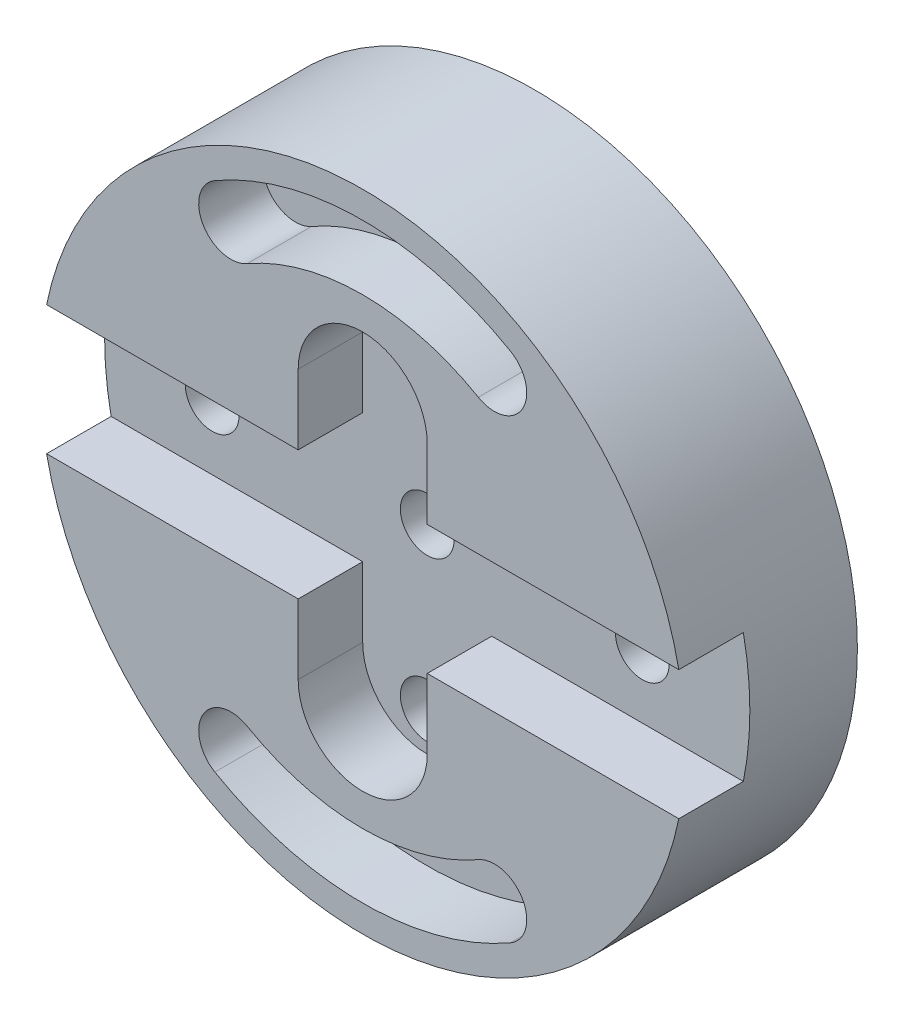
ISO-10303-21;
HEADER;
FILE_DESCRIPTION(('STEP AP214'),'2;1');
FILE_NAME('part.step','',(''),(''),'','','');
FILE_SCHEMA(('AUTOMOTIVE_DESIGN { 1 0 10303 214 1 1 1 1 }'));
ENDSEC;
DATA;
#1=APPLICATION_CONTEXT('core data for automotive mechanical design processes');
#2=APPLICATION_PROTOCOL_DEFINITION('international standard','automotive_design',2000,#1);
#3=PRODUCT_CONTEXT('',#1,'mechanical');
#4=PRODUCT('Part','Part','',(#3));
#5=PRODUCT_RELATED_PRODUCT_CATEGORY('part','',(#4));
#6=PRODUCT_DEFINITION_FORMATION('','',#4);
#7=PRODUCT_DEFINITION_CONTEXT('part definition',#1,'design');
#8=PRODUCT_DEFINITION('design','',#6,#7);
#9=PRODUCT_DEFINITION_SHAPE('','',#8);
#10=(LENGTH_UNIT() NAMED_UNIT(*) SI_UNIT(.MILLI.,.METRE.));
#11=(NAMED_UNIT(*) PLANE_ANGLE_UNIT() SI_UNIT($,.RADIAN.));
#12=(NAMED_UNIT(*) SI_UNIT($,.STERADIAN.) SOLID_ANGLE_UNIT());
#13=UNCERTAINTY_MEASURE_WITH_UNIT(LENGTH_MEASURE(1.E-05),#10,'distance_accuracy_value','');
#14=(GEOMETRIC_REPRESENTATION_CONTEXT(3) GLOBAL_UNCERTAINTY_ASSIGNED_CONTEXT((#13)) GLOBAL_UNIT_ASSIGNED_CONTEXT((#10,
#11,#12)) REPRESENTATION_CONTEXT('',''));
#15=CARTESIAN_POINT('',(0.,0.,0.));
#16=DIRECTION('',(0.,0.,1.));
#17=DIRECTION('',(1.,0.,0.));
#18=AXIS2_PLACEMENT_3D('',#15,#16,#17);
#19=CARTESIAN_POINT('',(0.,0.,32.));
#20=DIRECTION('',(0.,0.,-1.));
#21=DIRECTION('',(-1.,0.,0.));
#22=AXIS2_PLACEMENT_3D('',#19,#20,#21);
#23=CYLINDRICAL_SURFACE('',#22,60.);
#24=CARTESIAN_POINT('',(0.,0.,0.));
#25=DIRECTION('',(0.,0.,1.));
#26=DIRECTION('',(1.,0.,0.));
#27=AXIS2_PLACEMENT_3D('',#24,#25,#26);
#28=CIRCLE('',#27,60.);
#29=CARTESIAN_POINT('',(60.,0.,0.));
#30=VERTEX_POINT('',#29);
#31=EDGE_CURVE('E375',#30,#30,#28,.T.);
#32=ORIENTED_EDGE('',*,*,#31,.T.);
#33=EDGE_LOOP('',(#32));
#34=FACE_BOUND('',#33,.T.);
#35=DIRECTION('',(0.,0.,-1.));
#36=VECTOR('',#35,1.);
#37=CARTESIAN_POINT('',(-58.7877538267963,12.,32.));
#38=LINE('',#37,#36);
#39=CARTESIAN_POINT('',(-58.7877538267963,12.,32.));
#40=VERTEX_POINT('',#39);
#41=CARTESIAN_POINT('',(-58.7877538267963,12.,20.));
#42=VERTEX_POINT('',#41);
#43=EDGE_CURVE('E372',#40,#42,#38,.T.);
#44=ORIENTED_EDGE('',*,*,#43,.F.);
#45=CARTESIAN_POINT('',(0.,0.,32.));
#46=DIRECTION('',(0.,0.,1.));
#47=DIRECTION('',(1.,0.,0.));
#48=AXIS2_PLACEMENT_3D('',#45,#46,#47);
#49=CIRCLE('',#48,60.);
#50=CARTESIAN_POINT('',(58.7877538267963,12.,32.));
#51=VERTEX_POINT('',#50);
#52=EDGE_CURVE('E376',#51,#40,#49,.T.);
#53=ORIENTED_EDGE('',*,*,#52,.F.);
#54=DIRECTION('',(0.,0.,-1.));
#55=VECTOR('',#54,1.);
#56=CARTESIAN_POINT('',(58.7877538267963,12.,32.));
#57=LINE('',#56,#55);
#58=CARTESIAN_POINT('',(58.7877538267963,12.,20.));
#59=VERTEX_POINT('',#58);
#60=EDGE_CURVE('E369',#59,#51,#57,.F.);
#61=ORIENTED_EDGE('',*,*,#60,.F.);
#62=CARTESIAN_POINT('',(0.,0.,20.));
#63=DIRECTION('',(0.,0.,1.));
#64=DIRECTION('',(1.,0.,0.));
#65=AXIS2_PLACEMENT_3D('',#62,#63,#64);
#66=CIRCLE('',#65,60.);
#67=CARTESIAN_POINT('',(58.7877538267963,-12.,20.));
#68=VERTEX_POINT('',#67);
#69=EDGE_CURVE('E41',#68,#59,#66,.T.);
#70=ORIENTED_EDGE('',*,*,#69,.F.);
#71=DIRECTION('',(0.,0.,-1.));
#72=VECTOR('',#71,1.);
#73=CARTESIAN_POINT('',(58.7877538267963,-12.,32.));
#74=LINE('',#73,#72);
#75=CARTESIAN_POINT('',(58.7877538267963,-12.,32.));
#76=VERTEX_POINT('',#75);
#77=EDGE_CURVE('E365',#68,#76,#74,.F.);
#78=ORIENTED_EDGE('',*,*,#77,.T.);
#79=CARTESIAN_POINT('',(-58.7877538267963,-12.,32.));
#80=VERTEX_POINT('',#79);
#81=EDGE_CURVE('E381',#80,#76,#49,.T.);
#82=ORIENTED_EDGE('',*,*,#81,.F.);
#83=DIRECTION('',(0.,0.,-1.));
#84=VECTOR('',#83,1.);
#85=CARTESIAN_POINT('',(-58.7877538267963,-12.,32.));
#86=LINE('',#85,#84);
#87=CARTESIAN_POINT('',(-58.7877538267963,-12.,20.));
#88=VERTEX_POINT('',#87);
#89=EDGE_CURVE('E361',#80,#88,#86,.T.);
#90=ORIENTED_EDGE('',*,*,#89,.T.);
#91=EDGE_CURVE('E11',#42,#88,#66,.T.);
#92=ORIENTED_EDGE('',*,*,#91,.F.);
#93=EDGE_LOOP('',(#44,#53,#61,#70,#78,#82,#90,#92));
#94=FACE_BOUND('',#93,.T.);
#95=ADVANCED_FACE('F38',(#34,#94),#23,.T.);
#96=CARTESIAN_POINT('',(0.,0.,32.));
#97=DIRECTION('',(0.,0.,1.));
#98=DIRECTION('',(1.,0.,0.));
#99=AXIS2_PLACEMENT_3D('',#96,#97,#98);
#100=PLANE('',#99);
#101=CARTESIAN_POINT('',(24.5000000000001,42.4352447854375,32.));
#102=DIRECTION('',(0.,0.,1.));
#103=DIRECTION('',(1.,0.,0.));
#104=AXIS2_PLACEMENT_3D('',#101,#102,#103);
#105=CIRCLE('',#104,6.);
#106=CARTESIAN_POINT('',(21.5000000000001,37.2390923627308,32.));
#107=VERTEX_POINT('',#106);
#108=CARTESIAN_POINT('',(27.5000000000001,47.6313972081441,32.));
#109=VERTEX_POINT('',#108);
#110=EDGE_CURVE('E53',#107,#109,#105,.T.);
#111=ORIENTED_EDGE('',*,*,#110,.F.);
#112=CARTESIAN_POINT('',(0.,0.,32.));
#113=DIRECTION('',(0.,0.,-1.));
#114=DIRECTION('',(1.,0.,0.));
#115=AXIS2_PLACEMENT_3D('',#112,#113,#114);
#116=CIRCLE('',#115,43.);
#117=CARTESIAN_POINT('',(-21.5000000000001,37.2390923627308,32.));
#118=VERTEX_POINT('',#117);
#119=EDGE_CURVE('E197',#118,#107,#116,.T.);
#120=ORIENTED_EDGE('',*,*,#119,.F.);
#121=CARTESIAN_POINT('',(-24.5000000000001,42.4352447854375,32.));
#122=DIRECTION('',(0.,0.,1.));
#123=DIRECTION('',(1.,0.,0.));
#124=AXIS2_PLACEMENT_3D('',#121,#122,#123);
#125=CIRCLE('',#124,6.00000000000001);
#126=CARTESIAN_POINT('',(-27.5000000000001,47.6313972081441,32.));
#127=VERTEX_POINT('',#126);
#128=EDGE_CURVE('E201',#127,#118,#125,.T.);
#129=ORIENTED_EDGE('',*,*,#128,.F.);
#130=CARTESIAN_POINT('',(0.,0.,32.));
#131=DIRECTION('',(0.,0.,1.));
#132=DIRECTION('',(1.,0.,0.));
#133=AXIS2_PLACEMENT_3D('',#130,#131,#132);
#134=CIRCLE('',#133,55.);
#135=EDGE_CURVE('E213',#109,#127,#134,.T.);
#136=ORIENTED_EDGE('',*,*,#135,.F.);
#137=EDGE_LOOP('',(#111,#120,#129,#136));
#138=FACE_BOUND('',#137,.T.);
#139=ORIENTED_EDGE('',*,*,#52,.T.);
#140=DIRECTION('',(1.,0.,0.));
#141=VECTOR('',#140,1.);
#142=CARTESIAN_POINT('',(0.,12.,32.));
#143=LINE('',#142,#141);
#144=CARTESIAN_POINT('',(-12.,12.,32.));
#145=VERTEX_POINT('',#144);
#146=EDGE_CURVE('E386',#40,#145,#143,.T.);
#147=ORIENTED_EDGE('',*,*,#146,.T.);
#148=DIRECTION('',(0.,-1.,0.));
#149=VECTOR('',#148,1.);
#150=CARTESIAN_POINT('',(-12.,25.,32.));
#151=LINE('',#150,#149);
#152=CARTESIAN_POINT('',(-12.,25.,32.));
#153=VERTEX_POINT('',#152);
#154=EDGE_CURVE('E223',#153,#145,#151,.T.);
#155=ORIENTED_EDGE('',*,*,#154,.F.);
#156=CARTESIAN_POINT('',(0.,25.,32.));
#157=DIRECTION('',(0.,0.,1.));
#158=DIRECTION('',(1.,0.,0.));
#159=AXIS2_PLACEMENT_3D('',#156,#157,#158);
#160=CIRCLE('',#159,12.);
#161=CARTESIAN_POINT('',(12.,25.,32.));
#162=VERTEX_POINT('',#161);
#163=EDGE_CURVE('E311',#162,#153,#160,.T.);
#164=ORIENTED_EDGE('',*,*,#163,.F.);
#165=DIRECTION('',(0.,-1.,0.));
#166=VECTOR('',#165,1.);
#167=CARTESIAN_POINT('',(12.,25.,32.));
#168=LINE('',#167,#166);
#169=CARTESIAN_POINT('',(12.,12.,32.));
#170=VERTEX_POINT('',#169);
#171=EDGE_CURVE('E315',#162,#170,#168,.T.);
#172=ORIENTED_EDGE('',*,*,#171,.T.);
#173=DIRECTION('',(1.,0.,0.));
#174=VECTOR('',#173,1.);
#175=CARTESIAN_POINT('',(12.,12.,32.));
#176=LINE('',#175,#174);
#177=EDGE_CURVE('E319',#170,#51,#176,.T.);
#178=ORIENTED_EDGE('',*,*,#177,.T.);
#179=EDGE_LOOP('',(#139,#147,#155,#164,#172,#178));
#180=FACE_BOUND('',#179,.T.);
#181=ADVANCED_FACE('F408',(#138,#180),#100,.T.);
#182=CARTESIAN_POINT('',(0.,0.,32.));
#183=DIRECTION('',(0.,0.,-1.));
#184=DIRECTION('',(-1.,0.,0.));
#185=AXIS2_PLACEMENT_3D('',#182,#183,#184);
#186=CIRCLE('',#185,43.);
#187=CARTESIAN_POINT('',(21.5,-37.2390923627308,32.));
#188=VERTEX_POINT('',#187);
#189=CARTESIAN_POINT('',(-21.5000000000001,-37.2390923627308,32.));
#190=VERTEX_POINT('',#189);
#191=EDGE_CURVE('E61',#188,#190,#186,.T.);
#192=ORIENTED_EDGE('',*,*,#191,.F.);
#193=CARTESIAN_POINT('',(24.5000000000001,-42.4352447854375,32.));
#194=DIRECTION('',(0.,0.,1.));
#195=DIRECTION('',(-1.,0.,0.));
#196=AXIS2_PLACEMENT_3D('',#193,#194,#195);
#197=CIRCLE('',#196,6.);
#198=CARTESIAN_POINT('',(27.5000000000001,-47.6313972081441,32.));
#199=VERTEX_POINT('',#198);
#200=EDGE_CURVE('E234',#199,#188,#197,.T.);
#201=ORIENTED_EDGE('',*,*,#200,.F.);
#202=CARTESIAN_POINT('',(0.,0.,32.));
#203=DIRECTION('',(0.,0.,1.));
#204=DIRECTION('',(-1.,0.,0.));
#205=AXIS2_PLACEMENT_3D('',#202,#203,#204);
#206=CIRCLE('',#205,55.);
#207=CARTESIAN_POINT('',(-27.5000000000001,-47.6313972081441,32.));
#208=VERTEX_POINT('',#207);
#209=EDGE_CURVE('E253',#208,#199,#206,.T.);
#210=ORIENTED_EDGE('',*,*,#209,.F.);
#211=CARTESIAN_POINT('',(-24.5000000000001,-42.4352447854375,32.));
#212=DIRECTION('',(0.,0.,1.));
#213=DIRECTION('',(-1.,0.,0.));
#214=AXIS2_PLACEMENT_3D('',#211,#212,#213);
#215=CIRCLE('',#214,6.00000000000001);
#216=EDGE_CURVE('E249',#190,#208,#215,.T.);
#217=ORIENTED_EDGE('',*,*,#216,.F.);
#218=EDGE_LOOP('',(#192,#201,#210,#217));
#219=FACE_BOUND('',#218,.T.);
#220=DIRECTION('',(1.,0.,0.));
#221=VECTOR('',#220,1.);
#222=CARTESIAN_POINT('',(12.,-12.,32.));
#223=LINE('',#222,#221);
#224=CARTESIAN_POINT('',(12.,-12.,32.));
#225=VERTEX_POINT('',#224);
#226=EDGE_CURVE('E323',#225,#76,#223,.T.);
#227=ORIENTED_EDGE('',*,*,#226,.F.);
#228=DIRECTION('',(0.,-1.,0.));
#229=VECTOR('',#228,1.);
#230=CARTESIAN_POINT('',(12.,-12.,32.));
#231=LINE('',#230,#229);
#232=CARTESIAN_POINT('',(12.,-25.,32.));
#233=VERTEX_POINT('',#232);
#234=EDGE_CURVE('E326',#225,#233,#231,.T.);
#235=ORIENTED_EDGE('',*,*,#234,.T.);
#236=CARTESIAN_POINT('',(0.,-25.,32.));
#237=DIRECTION('',(0.,0.,1.));
#238=DIRECTION('',(1.,0.,0.));
#239=AXIS2_PLACEMENT_3D('',#236,#237,#238);
#240=CIRCLE('',#239,12.);
#241=CARTESIAN_POINT('',(-12.,-25.,32.));
#242=VERTEX_POINT('',#241);
#243=EDGE_CURVE('E330',#242,#233,#240,.T.);
#244=ORIENTED_EDGE('',*,*,#243,.F.);
#245=DIRECTION('',(0.,-1.,0.));
#246=VECTOR('',#245,1.);
#247=CARTESIAN_POINT('',(-12.,-12.,32.));
#248=LINE('',#247,#246);
#249=CARTESIAN_POINT('',(-12.,-12.,32.));
#250=VERTEX_POINT('',#249);
#251=EDGE_CURVE('E274',#250,#242,#248,.T.);
#252=ORIENTED_EDGE('',*,*,#251,.F.);
#253=DIRECTION('',(1.,0.,0.));
#254=VECTOR('',#253,1.);
#255=CARTESIAN_POINT('',(0.,-12.,32.));
#256=LINE('',#255,#254);
#257=EDGE_CURVE('E380',#80,#250,#256,.T.);
#258=ORIENTED_EDGE('',*,*,#257,.F.);
#259=ORIENTED_EDGE('',*,*,#81,.T.);
#260=EDGE_LOOP('',(#227,#235,#244,#252,#258,#259));
#261=FACE_BOUND('',#260,.T.);
#262=ADVANCED_FACE('F432',(#219,#261),#100,.T.);
#263=CARTESIAN_POINT('',(0.,0.,0.));
#264=DIRECTION('',(0.,0.,1.));
#265=DIRECTION('',(1.,0.,0.));
#266=AXIS2_PLACEMENT_3D('',#263,#264,#265);
#267=PLANE('',#266);
#268=CARTESIAN_POINT('',(40.,0.,0.));
#269=DIRECTION('',(0.,0.,1.));
#270=DIRECTION('',(1.,0.,0.));
#271=AXIS2_PLACEMENT_3D('',#268,#269,#270);
#272=CIRCLE('',#271,5.);
#273=CARTESIAN_POINT('',(45.,0.,0.));
#274=VERTEX_POINT('',#273);
#275=EDGE_CURVE('E204',#274,#274,#272,.T.);
#276=ORIENTED_EDGE('',*,*,#275,.T.);
#277=EDGE_LOOP('',(#276));
#278=FACE_BOUND('',#277,.T.);
#279=CARTESIAN_POINT('',(0.,30.,0.));
#280=DIRECTION('',(0.,0.,1.));
#281=DIRECTION('',(1.,0.,0.));
#282=AXIS2_PLACEMENT_3D('',#279,#280,#281);
#283=CIRCLE('',#282,5.);
#284=CARTESIAN_POINT('',(5.,30.,0.));
#285=VERTEX_POINT('',#284);
#286=EDGE_CURVE('E560',#285,#285,#283,.T.);
#287=ORIENTED_EDGE('',*,*,#286,.T.);
#288=EDGE_LOOP('',(#287));
#289=FACE_BOUND('',#288,.T.);
#290=CARTESIAN_POINT('',(0.,-30.,0.));
#291=DIRECTION('',(0.,0.,1.));
#292=DIRECTION('',(1.,0.,0.));
#293=AXIS2_PLACEMENT_3D('',#290,#291,#292);
#294=CIRCLE('',#293,5.);
#295=CARTESIAN_POINT('',(5.,-30.,0.));
#296=VERTEX_POINT('',#295);
#297=EDGE_CURVE('E557',#296,#296,#294,.T.);
#298=ORIENTED_EDGE('',*,*,#297,.T.);
#299=EDGE_LOOP('',(#298));
#300=FACE_BOUND('',#299,.T.);
#301=CARTESIAN_POINT('',(-40.,0.,0.));
#302=DIRECTION('',(0.,0.,1.));
#303=DIRECTION('',(1.,0.,0.));
#304=AXIS2_PLACEMENT_3D('',#301,#302,#303);
#305=CIRCLE('',#304,5.);
#306=CARTESIAN_POINT('',(-35.,0.,0.));
#307=VERTEX_POINT('',#306);
#308=EDGE_CURVE('E561',#307,#307,#305,.T.);
#309=ORIENTED_EDGE('',*,*,#308,.T.);
#310=EDGE_LOOP('',(#309));
#311=FACE_BOUND('',#310,.T.);
#312=CARTESIAN_POINT('',(0.,0.,0.));
#313=DIRECTION('',(0.,0.,1.));
#314=DIRECTION('',(1.,0.,0.));
#315=AXIS2_PLACEMENT_3D('',#312,#313,#314);
#316=CIRCLE('',#315,5.);
#317=CARTESIAN_POINT('',(5.,0.,0.));
#318=VERTEX_POINT('',#317);
#319=EDGE_CURVE('E567',#318,#318,#316,.T.);
#320=ORIENTED_EDGE('',*,*,#319,.T.);
#321=EDGE_LOOP('',(#320));
#322=FACE_BOUND('',#321,.T.);
#323=ORIENTED_EDGE('',*,*,#31,.F.);
#324=EDGE_LOOP('',(#323));
#325=FACE_BOUND('',#324,.T.);
#326=ADVANCED_FACE('F466',(#278,#289,#300,#311,#322,#325),#267,.F.);
#327=CARTESIAN_POINT('',(0.,25.,20.));
#328=DIRECTION('',(0.,0.,1.));
#329=DIRECTION('',(1.,0.,0.));
#330=AXIS2_PLACEMENT_3D('',#327,#328,#329);
#331=PLANE('',#330);
#332=CARTESIAN_POINT('',(40.,0.,20.));
#333=DIRECTION('',(0.,0.,1.));
#334=DIRECTION('',(1.,0.,0.));
#335=AXIS2_PLACEMENT_3D('',#332,#333,#334);
#336=CIRCLE('',#335,5.);
#337=CARTESIAN_POINT('',(45.,0.,20.));
#338=VERTEX_POINT('',#337);
#339=EDGE_CURVE('E577',#338,#338,#336,.T.);
#340=ORIENTED_EDGE('',*,*,#339,.F.);
#341=EDGE_LOOP('',(#340));
#342=FACE_BOUND('',#341,.T.);
#343=CARTESIAN_POINT('',(0.,30.,20.));
#344=DIRECTION('',(0.,0.,1.));
#345=DIRECTION('',(1.,0.,0.));
#346=AXIS2_PLACEMENT_3D('',#343,#344,#345);
#347=CIRCLE('',#346,5.);
#348=CARTESIAN_POINT('',(5.,30.,20.));
#349=VERTEX_POINT('',#348);
#350=EDGE_CURVE('E578',#349,#349,#347,.T.);
#351=ORIENTED_EDGE('',*,*,#350,.F.);
#352=EDGE_LOOP('',(#351));
#353=FACE_BOUND('',#352,.T.);
#354=CARTESIAN_POINT('',(0.,-30.,20.));
#355=DIRECTION('',(0.,0.,1.));
#356=DIRECTION('',(-1.,0.,0.));
#357=AXIS2_PLACEMENT_3D('',#354,#355,#356);
#358=CIRCLE('',#357,5.);
#359=CARTESIAN_POINT('',(-5.,-30.,20.));
#360=VERTEX_POINT('',#359);
#361=EDGE_CURVE('E554',#360,#360,#358,.T.);
#362=ORIENTED_EDGE('',*,*,#361,.F.);
#363=EDGE_LOOP('',(#362));
#364=FACE_BOUND('',#363,.T.);
#365=CARTESIAN_POINT('',(-40.,0.,20.));
#366=DIRECTION('',(0.,0.,1.));
#367=DIRECTION('',(-1.,0.,0.));
#368=AXIS2_PLACEMENT_3D('',#365,#366,#367);
#369=CIRCLE('',#368,5.);
#370=CARTESIAN_POINT('',(-45.,0.,20.));
#371=VERTEX_POINT('',#370);
#372=EDGE_CURVE('E585',#371,#371,#369,.T.);
#373=ORIENTED_EDGE('',*,*,#372,.F.);
#374=EDGE_LOOP('',(#373));
#375=FACE_BOUND('',#374,.T.);
#376=CARTESIAN_POINT('',(0.,0.,20.));
#377=DIRECTION('',(0.,0.,1.));
#378=DIRECTION('',(1.,0.,0.));
#379=AXIS2_PLACEMENT_3D('',#376,#377,#378);
#380=CIRCLE('',#379,5.);
#381=CARTESIAN_POINT('',(5.,0.,20.));
#382=VERTEX_POINT('',#381);
#383=EDGE_CURVE('E573',#382,#382,#380,.T.);
#384=ORIENTED_EDGE('',*,*,#383,.F.);
#385=EDGE_LOOP('',(#384));
#386=FACE_BOUND('',#385,.T.);
#387=ORIENTED_EDGE('',*,*,#91,.T.);
#388=DIRECTION('',(1.,0.,0.));
#389=VECTOR('',#388,1.);
#390=CARTESIAN_POINT('',(-72.4884918212937,-12.,20.));
#391=LINE('',#390,#389);
#392=CARTESIAN_POINT('',(-12.,-12.,20.));
#393=VERTEX_POINT('',#392);
#394=EDGE_CURVE('E304',#88,#393,#391,.T.);
#395=ORIENTED_EDGE('',*,*,#394,.T.);
#396=DIRECTION('',(0.,-1.,0.));
#397=VECTOR('',#396,1.);
#398=CARTESIAN_POINT('',(-12.,-12.,20.));
#399=LINE('',#398,#397);
#400=CARTESIAN_POINT('',(-12.,-25.,20.));
#401=VERTEX_POINT('',#400);
#402=EDGE_CURVE('E300',#393,#401,#399,.T.);
#403=ORIENTED_EDGE('',*,*,#402,.T.);
#404=CARTESIAN_POINT('',(0.,-25.,20.));
#405=DIRECTION('',(0.,0.,1.));
#406=DIRECTION('',(1.,0.,0.));
#407=AXIS2_PLACEMENT_3D('',#404,#405,#406);
#408=CIRCLE('',#407,12.);
#409=CARTESIAN_POINT('',(12.,-25.,20.));
#410=VERTEX_POINT('',#409);
#411=EDGE_CURVE('E296',#401,#410,#408,.T.);
#412=ORIENTED_EDGE('',*,*,#411,.T.);
#413=DIRECTION('',(0.,-1.,0.));
#414=VECTOR('',#413,1.);
#415=CARTESIAN_POINT('',(12.,-12.,20.));
#416=LINE('',#415,#414);
#417=CARTESIAN_POINT('',(12.,-12.,20.));
#418=VERTEX_POINT('',#417);
#419=EDGE_CURVE('E293',#418,#410,#416,.T.);
#420=ORIENTED_EDGE('',*,*,#419,.F.);
#421=DIRECTION('',(1.,0.,0.));
#422=VECTOR('',#421,1.);
#423=CARTESIAN_POINT('',(12.,-12.,20.));
#424=LINE('',#423,#422);
#425=EDGE_CURVE('E289',#418,#68,#424,.T.);
#426=ORIENTED_EDGE('',*,*,#425,.T.);
#427=ORIENTED_EDGE('',*,*,#69,.T.);
#428=DIRECTION('',(1.,0.,0.));
#429=VECTOR('',#428,1.);
#430=CARTESIAN_POINT('',(12.,12.,20.));
#431=LINE('',#430,#429);
#432=CARTESIAN_POINT('',(12.,12.,20.));
#433=VERTEX_POINT('',#432);
#434=EDGE_CURVE('E285',#433,#59,#431,.T.);
#435=ORIENTED_EDGE('',*,*,#434,.F.);
#436=DIRECTION('',(0.,-1.,0.));
#437=VECTOR('',#436,1.);
#438=CARTESIAN_POINT('',(12.,25.,20.));
#439=LINE('',#438,#437);
#440=CARTESIAN_POINT('',(12.,25.,20.));
#441=VERTEX_POINT('',#440);
#442=EDGE_CURVE('E282',#441,#433,#439,.T.);
#443=ORIENTED_EDGE('',*,*,#442,.F.);
#444=CARTESIAN_POINT('',(0.,25.,20.));
#445=DIRECTION('',(0.,0.,1.));
#446=DIRECTION('',(1.,0.,0.));
#447=AXIS2_PLACEMENT_3D('',#444,#445,#446);
#448=CIRCLE('',#447,12.);
#449=CARTESIAN_POINT('',(-12.,25.,20.));
#450=VERTEX_POINT('',#449);
#451=EDGE_CURVE('E278',#441,#450,#448,.T.);
#452=ORIENTED_EDGE('',*,*,#451,.T.);
#453=DIRECTION('',(0.,-1.,0.));
#454=VECTOR('',#453,1.);
#455=CARTESIAN_POINT('',(-12.,25.,20.));
#456=LINE('',#455,#454);
#457=CARTESIAN_POINT('',(-12.,12.,20.));
#458=VERTEX_POINT('',#457);
#459=EDGE_CURVE('E273',#450,#458,#456,.T.);
#460=ORIENTED_EDGE('',*,*,#459,.T.);
#461=DIRECTION('',(1.,0.,0.));
#462=VECTOR('',#461,1.);
#463=CARTESIAN_POINT('',(-72.4884918212937,12.,20.));
#464=LINE('',#463,#462);
#465=EDGE_CURVE('E270',#42,#458,#464,.T.);
#466=ORIENTED_EDGE('',*,*,#465,.F.);
#467=EDGE_LOOP('',(#387,#395,#403,#412,#420,#426,#427,#435,#443,#452,#460,#466));
#468=FACE_BOUND('',#467,.T.);
#469=ADVANCED_FACE('F395',(#342,#353,#364,#375,#386,#468),#331,.T.);
#470=CARTESIAN_POINT('',(-72.4884918212937,12.,20.));
#471=DIRECTION('',(0.,-1.,0.));
#472=DIRECTION('',(1.,0.,0.));
#473=AXIS2_PLACEMENT_3D('',#470,#471,#472);
#474=PLANE('',#473);
#475=ORIENTED_EDGE('',*,*,#43,.T.);
#476=ORIENTED_EDGE('',*,*,#465,.T.);
#477=DIRECTION('',(0.,0.,1.));
#478=VECTOR('',#477,1.);
#479=CARTESIAN_POINT('',(-12.,12.,20.));
#480=LINE('',#479,#478);
#481=EDGE_CURVE('E358',#458,#145,#480,.T.);
#482=ORIENTED_EDGE('',*,*,#481,.T.);
#483=ORIENTED_EDGE('',*,*,#146,.F.);
#484=EDGE_LOOP('',(#475,#476,#482,#483));
#485=FACE_BOUND('',#484,.T.);
#486=ADVANCED_FACE('F453',(#485),#474,.T.);
#487=CARTESIAN_POINT('',(12.,12.,20.));
#488=DIRECTION('',(0.,-1.,0.));
#489=DIRECTION('',(0.,0.,-1.));
#490=AXIS2_PLACEMENT_3D('',#487,#488,#489);
#491=PLANE('',#490);
#492=ORIENTED_EDGE('',*,*,#60,.T.);
#493=ORIENTED_EDGE('',*,*,#177,.F.);
#494=DIRECTION('',(0.,0.,1.));
#495=VECTOR('',#494,1.);
#496=CARTESIAN_POINT('',(12.,12.,20.));
#497=LINE('',#496,#495);
#498=EDGE_CURVE('E349',#433,#170,#497,.T.);
#499=ORIENTED_EDGE('',*,*,#498,.F.);
#500=ORIENTED_EDGE('',*,*,#434,.T.);
#501=EDGE_LOOP('',(#492,#493,#499,#500));
#502=FACE_BOUND('',#501,.T.);
#503=ADVANCED_FACE('F403',(#502),#491,.T.);
#504=CARTESIAN_POINT('',(12.,-12.,20.));
#505=DIRECTION('',(0.,-1.,0.));
#506=DIRECTION('',(1.,0.,0.));
#507=AXIS2_PLACEMENT_3D('',#504,#505,#506);
#508=PLANE('',#507);
#509=ORIENTED_EDGE('',*,*,#425,.F.);
#510=DIRECTION('',(0.,0.,1.));
#511=VECTOR('',#510,1.);
#512=CARTESIAN_POINT('',(12.,-12.,20.));
#513=LINE('',#512,#511);
#514=EDGE_CURVE('E346',#418,#225,#513,.T.);
#515=ORIENTED_EDGE('',*,*,#514,.T.);
#516=ORIENTED_EDGE('',*,*,#226,.T.);
#517=ORIENTED_EDGE('',*,*,#77,.F.);
#518=EDGE_LOOP('',(#509,#515,#516,#517));
#519=FACE_BOUND('',#518,.T.);
#520=ADVANCED_FACE('F445',(#519),#508,.F.);
#521=CARTESIAN_POINT('',(-72.4884918212937,-12.,20.));
#522=DIRECTION('',(0.,-1.,0.));
#523=DIRECTION('',(1.,0.,0.));
#524=AXIS2_PLACEMENT_3D('',#521,#522,#523);
#525=PLANE('',#524);
#526=ORIENTED_EDGE('',*,*,#257,.T.);
#527=DIRECTION('',(0.,0.,1.));
#528=VECTOR('',#527,1.);
#529=CARTESIAN_POINT('',(-12.,-12.,20.));
#530=LINE('',#529,#528);
#531=EDGE_CURVE('E307',#393,#250,#530,.T.);
#532=ORIENTED_EDGE('',*,*,#531,.F.);
#533=ORIENTED_EDGE('',*,*,#394,.F.);
#534=ORIENTED_EDGE('',*,*,#89,.F.);
#535=EDGE_LOOP('',(#526,#532,#533,#534));
#536=FACE_BOUND('',#535,.T.);
#537=ADVANCED_FACE('F427',(#536),#525,.F.);
#538=CARTESIAN_POINT('',(-12.,25.,20.));
#539=DIRECTION('',(-1.,0.,0.));
#540=DIRECTION('',(0.,-1.,0.));
#541=AXIS2_PLACEMENT_3D('',#538,#539,#540);
#542=PLANE('',#541);
#543=ORIENTED_EDGE('',*,*,#154,.T.);
#544=ORIENTED_EDGE('',*,*,#481,.F.);
#545=ORIENTED_EDGE('',*,*,#459,.F.);
#546=DIRECTION('',(0.,0.,1.));
#547=VECTOR('',#546,1.);
#548=CARTESIAN_POINT('',(-12.,25.,20.));
#549=LINE('',#548,#547);
#550=EDGE_CURVE('E355',#450,#153,#549,.T.);
#551=ORIENTED_EDGE('',*,*,#550,.T.);
#552=EDGE_LOOP('',(#543,#544,#545,#551));
#553=FACE_BOUND('',#552,.T.);
#554=ADVANCED_FACE('F419',(#553),#542,.F.);
#555=CARTESIAN_POINT('',(0.,25.,20.));
#556=DIRECTION('',(0.,0.,1.));
#557=DIRECTION('',(1.,0.,0.));
#558=AXIS2_PLACEMENT_3D('',#555,#556,#557);
#559=CYLINDRICAL_SURFACE('',#558,12.);
#560=ORIENTED_EDGE('',*,*,#163,.T.);
#561=ORIENTED_EDGE('',*,*,#550,.F.);
#562=ORIENTED_EDGE('',*,*,#451,.F.);
#563=DIRECTION('',(0.,0.,1.));
#564=VECTOR('',#563,1.);
#565=CARTESIAN_POINT('',(12.,25.,20.));
#566=LINE('',#565,#564);
#567=EDGE_CURVE('E352',#441,#162,#566,.T.);
#568=ORIENTED_EDGE('',*,*,#567,.T.);
#569=EDGE_LOOP('',(#560,#561,#562,#568));
#570=FACE_BOUND('',#569,.T.);
#571=ADVANCED_FACE('F415',(#570),#559,.F.);
#572=CARTESIAN_POINT('',(12.,25.,20.));
#573=DIRECTION('',(-1.,0.,0.));
#574=DIRECTION('',(0.,-1.,0.));
#575=AXIS2_PLACEMENT_3D('',#572,#573,#574);
#576=PLANE('',#575);
#577=ORIENTED_EDGE('',*,*,#171,.F.);
#578=ORIENTED_EDGE('',*,*,#567,.F.);
#579=ORIENTED_EDGE('',*,*,#442,.T.);
#580=ORIENTED_EDGE('',*,*,#498,.T.);
#581=EDGE_LOOP('',(#577,#578,#579,#580));
#582=FACE_BOUND('',#581,.T.);
#583=ADVANCED_FACE('F412',(#582),#576,.T.);
#584=CARTESIAN_POINT('',(12.,-12.,20.));
#585=DIRECTION('',(-1.,0.,0.));
#586=DIRECTION('',(0.,-1.,0.));
#587=AXIS2_PLACEMENT_3D('',#584,#585,#586);
#588=PLANE('',#587);
#589=ORIENTED_EDGE('',*,*,#234,.F.);
#590=ORIENTED_EDGE('',*,*,#514,.F.);
#591=ORIENTED_EDGE('',*,*,#419,.T.);
#592=DIRECTION('',(0.,0.,1.));
#593=VECTOR('',#592,1.);
#594=CARTESIAN_POINT('',(12.,-25.,20.));
#595=LINE('',#594,#593);
#596=EDGE_CURVE('E343',#410,#233,#595,.T.);
#597=ORIENTED_EDGE('',*,*,#596,.T.);
#598=EDGE_LOOP('',(#589,#590,#591,#597));
#599=FACE_BOUND('',#598,.T.);
#600=ADVANCED_FACE('F443',(#599),#588,.T.);
#601=CARTESIAN_POINT('',(0.,-25.,20.));
#602=DIRECTION('',(0.,0.,1.));
#603=DIRECTION('',(1.,0.,0.));
#604=AXIS2_PLACEMENT_3D('',#601,#602,#603);
#605=CYLINDRICAL_SURFACE('',#604,12.);
#606=ORIENTED_EDGE('',*,*,#243,.T.);
#607=ORIENTED_EDGE('',*,*,#596,.F.);
#608=ORIENTED_EDGE('',*,*,#411,.F.);
#609=DIRECTION('',(0.,0.,1.));
#610=VECTOR('',#609,1.);
#611=CARTESIAN_POINT('',(-12.,-25.,20.));
#612=LINE('',#611,#610);
#613=EDGE_CURVE('E340',#401,#242,#612,.T.);
#614=ORIENTED_EDGE('',*,*,#613,.T.);
#615=EDGE_LOOP('',(#606,#607,#608,#614));
#616=FACE_BOUND('',#615,.T.);
#617=ADVANCED_FACE('F440',(#616),#605,.F.);
#618=CARTESIAN_POINT('',(-12.,-12.,20.));
#619=DIRECTION('',(-1.,0.,0.));
#620=DIRECTION('',(0.,-1.,0.));
#621=AXIS2_PLACEMENT_3D('',#618,#619,#620);
#622=PLANE('',#621);
#623=ORIENTED_EDGE('',*,*,#251,.T.);
#624=ORIENTED_EDGE('',*,*,#613,.F.);
#625=ORIENTED_EDGE('',*,*,#402,.F.);
#626=ORIENTED_EDGE('',*,*,#531,.T.);
#627=EDGE_LOOP('',(#623,#624,#625,#626));
#628=FACE_BOUND('',#627,.T.);
#629=ADVANCED_FACE('F435',(#628),#622,.F.);
#630=CARTESIAN_POINT('',(0.,0.,20.));
#631=DIRECTION('',(0.,0.,1.));
#632=DIRECTION('',(1.,0.,0.));
#633=AXIS2_PLACEMENT_3D('',#630,#631,#632);
#634=CYLINDRICAL_SURFACE('',#633,43.);
#635=ORIENTED_EDGE('',*,*,#191,.T.);
#636=DIRECTION('',(0.,0.,1.));
#637=VECTOR('',#636,1.);
#638=CARTESIAN_POINT('',(-21.5000000000001,-37.2390923627308,20.));
#639=LINE('',#638,#637);
#640=CARTESIAN_POINT('',(-21.5000000000001,-37.2390923627308,20.));
#641=VERTEX_POINT('',#640);
#642=EDGE_CURVE('E246',#641,#190,#639,.T.);
#643=ORIENTED_EDGE('',*,*,#642,.F.);
#644=CARTESIAN_POINT('',(0.,0.,20.));
#645=DIRECTION('',(0.,0.,-1.));
#646=DIRECTION('',(-1.,0.,0.));
#647=AXIS2_PLACEMENT_3D('',#644,#645,#646);
#648=CIRCLE('',#647,43.);
#649=CARTESIAN_POINT('',(21.5,-37.2390923627308,20.));
#650=VERTEX_POINT('',#649);
#651=EDGE_CURVE('E229',#650,#641,#648,.T.);
#652=ORIENTED_EDGE('',*,*,#651,.F.);
#653=DIRECTION('',(0.,0.,1.));
#654=VECTOR('',#653,1.);
#655=CARTESIAN_POINT('',(21.5,-37.2390923627308,20.));
#656=LINE('',#655,#654);
#657=EDGE_CURVE('E214',#650,#188,#656,.T.);
#658=ORIENTED_EDGE('',*,*,#657,.T.);
#659=EDGE_LOOP('',(#635,#643,#652,#658));
#660=FACE_BOUND('',#659,.T.);
#661=ADVANCED_FACE('F496',(#660),#634,.T.);
#662=CARTESIAN_POINT('',(24.5000000000001,-42.4352447854375,20.));
#663=DIRECTION('',(0.,0.,1.));
#664=DIRECTION('',(1.,0.,0.));
#665=AXIS2_PLACEMENT_3D('',#662,#663,#664);
#666=CYLINDRICAL_SURFACE('',#665,6.);
#667=ORIENTED_EDGE('',*,*,#200,.T.);
#668=ORIENTED_EDGE('',*,*,#657,.F.);
#669=CARTESIAN_POINT('',(24.5000000000001,-42.4352447854375,20.));
#670=DIRECTION('',(0.,0.,1.));
#671=DIRECTION('',(-1.,0.,0.));
#672=AXIS2_PLACEMENT_3D('',#669,#670,#671);
#673=CIRCLE('',#672,6.);
#674=CARTESIAN_POINT('',(27.5000000000001,-47.6313972081441,20.));
#675=VERTEX_POINT('',#674);
#676=EDGE_CURVE('E242',#675,#650,#673,.T.);
#677=ORIENTED_EDGE('',*,*,#676,.F.);
#678=DIRECTION('',(0.,0.,1.));
#679=VECTOR('',#678,1.);
#680=CARTESIAN_POINT('',(27.5000000000001,-47.6313972081441,20.));
#681=LINE('',#680,#679);
#682=EDGE_CURVE('E262',#675,#199,#681,.T.);
#683=ORIENTED_EDGE('',*,*,#682,.T.);
#684=EDGE_LOOP('',(#667,#668,#677,#683));
#685=FACE_BOUND('',#684,.T.);
#686=ADVANCED_FACE('F500',(#685),#666,.F.);
#687=CARTESIAN_POINT('',(0.,0.,20.));
#688=DIRECTION('',(0.,0.,1.));
#689=DIRECTION('',(1.,0.,0.));
#690=AXIS2_PLACEMENT_3D('',#687,#688,#689);
#691=CYLINDRICAL_SURFACE('',#690,55.);
#692=ORIENTED_EDGE('',*,*,#209,.T.);
#693=ORIENTED_EDGE('',*,*,#682,.F.);
#694=CARTESIAN_POINT('',(0.,0.,20.));
#695=DIRECTION('',(0.,0.,1.));
#696=DIRECTION('',(-1.,0.,0.));
#697=AXIS2_PLACEMENT_3D('',#694,#695,#696);
#698=CIRCLE('',#697,55.);
#699=CARTESIAN_POINT('',(-27.5000000000001,-47.6313972081441,20.));
#700=VERTEX_POINT('',#699);
#701=EDGE_CURVE('E238',#700,#675,#698,.T.);
#702=ORIENTED_EDGE('',*,*,#701,.F.);
#703=DIRECTION('',(0.,0.,1.));
#704=VECTOR('',#703,1.);
#705=CARTESIAN_POINT('',(-27.5000000000001,-47.6313972081441,20.));
#706=LINE('',#705,#704);
#707=EDGE_CURVE('E265',#700,#208,#706,.T.);
#708=ORIENTED_EDGE('',*,*,#707,.T.);
#709=EDGE_LOOP('',(#692,#693,#702,#708));
#710=FACE_BOUND('',#709,.T.);
#711=ADVANCED_FACE('F505',(#710),#691,.F.);
#712=CARTESIAN_POINT('',(-24.5000000000001,-42.4352447854375,20.));
#713=DIRECTION('',(0.,0.,1.));
#714=DIRECTION('',(1.,0.,0.));
#715=AXIS2_PLACEMENT_3D('',#712,#713,#714);
#716=CYLINDRICAL_SURFACE('',#715,6.00000000000001);
#717=ORIENTED_EDGE('',*,*,#216,.T.);
#718=ORIENTED_EDGE('',*,*,#707,.F.);
#719=CARTESIAN_POINT('',(-24.5000000000001,-42.4352447854375,20.));
#720=DIRECTION('',(0.,0.,1.));
#721=DIRECTION('',(-1.,0.,0.));
#722=AXIS2_PLACEMENT_3D('',#719,#720,#721);
#723=CIRCLE('',#722,6.00000000000001);
#724=EDGE_CURVE('E233',#641,#700,#723,.T.);
#725=ORIENTED_EDGE('',*,*,#724,.F.);
#726=ORIENTED_EDGE('',*,*,#642,.T.);
#727=EDGE_LOOP('',(#717,#718,#725,#726));
#728=FACE_BOUND('',#727,.T.);
#729=ADVANCED_FACE('F501',(#728),#716,.F.);
#730=CARTESIAN_POINT('',(-12.25,-21.2176223927187,20.));
#731=DIRECTION('',(0.,0.,-1.));
#732=DIRECTION('',(-1.,0.,0.));
#733=AXIS2_PLACEMENT_3D('',#730,#731,#732);
#734=PLANE('',#733);
#735=ORIENTED_EDGE('',*,*,#651,.T.);
#736=ORIENTED_EDGE('',*,*,#724,.T.);
#737=ORIENTED_EDGE('',*,*,#701,.T.);
#738=ORIENTED_EDGE('',*,*,#676,.T.);
#739=EDGE_LOOP('',(#735,#736,#737,#738));
#740=FACE_BOUND('',#739,.T.);
#741=ADVANCED_FACE('F504',(#740),#734,.F.);
#742=CARTESIAN_POINT('',(24.5000000000001,42.4352447854375,20.));
#743=DIRECTION('',(0.,0.,1.));
#744=DIRECTION('',(1.,0.,0.));
#745=AXIS2_PLACEMENT_3D('',#742,#743,#744);
#746=CYLINDRICAL_SURFACE('',#745,6.);
#747=ORIENTED_EDGE('',*,*,#110,.T.);
#748=DIRECTION('',(0.,0.,1.));
#749=VECTOR('',#748,1.);
#750=CARTESIAN_POINT('',(27.5000000000001,47.6313972081441,20.));
#751=LINE('',#750,#749);
#752=CARTESIAN_POINT('',(27.5000000000001,47.6313972081441,20.));
#753=VERTEX_POINT('',#752);
#754=EDGE_CURVE('E172',#753,#109,#751,.T.);
#755=ORIENTED_EDGE('',*,*,#754,.F.);
#756=CARTESIAN_POINT('',(24.5000000000001,42.4352447854375,20.));
#757=DIRECTION('',(0.,0.,1.));
#758=DIRECTION('',(1.,0.,0.));
#759=AXIS2_PLACEMENT_3D('',#756,#757,#758);
#760=CIRCLE('',#759,6.);
#761=CARTESIAN_POINT('',(21.5000000000001,37.2390923627308,20.));
#762=VERTEX_POINT('',#761);
#763=EDGE_CURVE('E176',#762,#753,#760,.T.);
#764=ORIENTED_EDGE('',*,*,#763,.F.);
#765=DIRECTION('',(0.,0.,1.));
#766=VECTOR('',#765,1.);
#767=CARTESIAN_POINT('',(21.5000000000001,37.2390923627308,20.));
#768=LINE('',#767,#766);
#769=EDGE_CURVE('E220',#762,#107,#768,.T.);
#770=ORIENTED_EDGE('',*,*,#769,.T.);
#771=EDGE_LOOP('',(#747,#755,#764,#770));
#772=FACE_BOUND('',#771,.T.);
#773=ADVANCED_FACE('F174',(#772),#746,.F.);
#774=CARTESIAN_POINT('',(0.,0.,20.));
#775=DIRECTION('',(0.,0.,1.));
#776=DIRECTION('',(1.,0.,0.));
#777=AXIS2_PLACEMENT_3D('',#774,#775,#776);
#778=CYLINDRICAL_SURFACE('',#777,43.);
#779=ORIENTED_EDGE('',*,*,#119,.T.);
#780=ORIENTED_EDGE('',*,*,#769,.F.);
#781=CARTESIAN_POINT('',(0.,0.,20.));
#782=DIRECTION('',(0.,0.,-1.));
#783=DIRECTION('',(1.,0.,0.));
#784=AXIS2_PLACEMENT_3D('',#781,#782,#783);
#785=CIRCLE('',#784,43.);
#786=CARTESIAN_POINT('',(-21.5000000000001,37.2390923627308,20.));
#787=VERTEX_POINT('',#786);
#788=EDGE_CURVE('E183',#787,#762,#785,.T.);
#789=ORIENTED_EDGE('',*,*,#788,.F.);
#790=DIRECTION('',(0.,0.,1.));
#791=VECTOR('',#790,1.);
#792=CARTESIAN_POINT('',(-21.5000000000001,37.2390923627308,20.));
#793=LINE('',#792,#791);
#794=EDGE_CURVE('E224',#787,#118,#793,.T.);
#795=ORIENTED_EDGE('',*,*,#794,.T.);
#796=EDGE_LOOP('',(#779,#780,#789,#795));
#797=FACE_BOUND('',#796,.T.);
#798=ADVANCED_FACE('F518',(#797),#778,.T.);
#799=CARTESIAN_POINT('',(-24.5000000000001,42.4352447854375,20.));
#800=DIRECTION('',(0.,0.,1.));
#801=DIRECTION('',(1.,0.,0.));
#802=AXIS2_PLACEMENT_3D('',#799,#800,#801);
#803=CYLINDRICAL_SURFACE('',#802,6.00000000000001);
#804=ORIENTED_EDGE('',*,*,#128,.T.);
#805=ORIENTED_EDGE('',*,*,#794,.F.);
#806=CARTESIAN_POINT('',(-24.5000000000001,42.4352447854375,20.));
#807=DIRECTION('',(0.,0.,1.));
#808=DIRECTION('',(1.,0.,0.));
#809=AXIS2_PLACEMENT_3D('',#806,#807,#808);
#810=CIRCLE('',#809,6.00000000000001);
#811=CARTESIAN_POINT('',(-27.5000000000001,47.6313972081441,20.));
#812=VERTEX_POINT('',#811);
#813=EDGE_CURVE('E192',#812,#787,#810,.T.);
#814=ORIENTED_EDGE('',*,*,#813,.F.);
#815=DIRECTION('',(0.,0.,1.));
#816=VECTOR('',#815,1.);
#817=CARTESIAN_POINT('',(-27.5000000000001,47.6313972081441,20.));
#818=LINE('',#817,#816);
#819=EDGE_CURVE('E182',#812,#127,#818,.T.);
#820=ORIENTED_EDGE('',*,*,#819,.T.);
#821=EDGE_LOOP('',(#804,#805,#814,#820));
#822=FACE_BOUND('',#821,.T.);
#823=ADVANCED_FACE('F521',(#822),#803,.F.);
#824=CARTESIAN_POINT('',(0.,0.,20.));
#825=DIRECTION('',(0.,0.,1.));
#826=DIRECTION('',(1.,0.,0.));
#827=AXIS2_PLACEMENT_3D('',#824,#825,#826);
#828=CYLINDRICAL_SURFACE('',#827,55.);
#829=ORIENTED_EDGE('',*,*,#135,.T.);
#830=ORIENTED_EDGE('',*,*,#819,.F.);
#831=CARTESIAN_POINT('',(0.,0.,20.));
#832=DIRECTION('',(0.,0.,1.));
#833=DIRECTION('',(1.,0.,0.));
#834=AXIS2_PLACEMENT_3D('',#831,#832,#833);
#835=CIRCLE('',#834,55.);
#836=EDGE_CURVE('E186',#753,#812,#835,.T.);
#837=ORIENTED_EDGE('',*,*,#836,.F.);
#838=ORIENTED_EDGE('',*,*,#754,.T.);
#839=EDGE_LOOP('',(#829,#830,#837,#838));
#840=FACE_BOUND('',#839,.T.);
#841=ADVANCED_FACE('F187',(#840),#828,.F.);
#842=CARTESIAN_POINT('',(12.25,21.2176223927187,20.));
#843=DIRECTION('',(0.,0.,1.));
#844=DIRECTION('',(1.,0.,0.));
#845=AXIS2_PLACEMENT_3D('',#842,#843,#844);
#846=PLANE('',#845);
#847=ORIENTED_EDGE('',*,*,#763,.T.);
#848=ORIENTED_EDGE('',*,*,#836,.T.);
#849=ORIENTED_EDGE('',*,*,#813,.T.);
#850=ORIENTED_EDGE('',*,*,#788,.T.);
#851=EDGE_LOOP('',(#847,#848,#849,#850));
#852=FACE_BOUND('',#851,.T.);
#853=ADVANCED_FACE('F194',(#852),#846,.T.);
#854=CARTESIAN_POINT('',(0.,0.,-72.));
#855=DIRECTION('',(0.,0.,1.));
#856=DIRECTION('',(1.,0.,0.));
#857=AXIS2_PLACEMENT_3D('',#854,#855,#856);
#858=CYLINDRICAL_SURFACE('',#857,5.);
#859=ORIENTED_EDGE('',*,*,#383,.T.);
#860=EDGE_LOOP('',(#859));
#861=FACE_BOUND('',#860,.T.);
#862=ORIENTED_EDGE('',*,*,#319,.F.);
#863=EDGE_LOOP('',(#862));
#864=FACE_BOUND('',#863,.T.);
#865=ADVANCED_FACE('F530',(#861,#864),#858,.F.);
#866=CARTESIAN_POINT('',(-40.,0.,-72.));
#867=DIRECTION('',(0.,0.,1.));
#868=DIRECTION('',(1.,0.,0.));
#869=AXIS2_PLACEMENT_3D('',#866,#867,#868);
#870=CYLINDRICAL_SURFACE('',#869,5.);
#871=ORIENTED_EDGE('',*,*,#372,.T.);
#872=EDGE_LOOP('',(#871));
#873=FACE_BOUND('',#872,.T.);
#874=ORIENTED_EDGE('',*,*,#308,.F.);
#875=EDGE_LOOP('',(#874));
#876=FACE_BOUND('',#875,.T.);
#877=ADVANCED_FACE('F533',(#873,#876),#870,.F.);
#878=CARTESIAN_POINT('',(0.,-30.,-72.));
#879=DIRECTION('',(0.,0.,1.));
#880=DIRECTION('',(1.,0.,0.));
#881=AXIS2_PLACEMENT_3D('',#878,#879,#880);
#882=CYLINDRICAL_SURFACE('',#881,5.);
#883=ORIENTED_EDGE('',*,*,#361,.T.);
#884=EDGE_LOOP('',(#883));
#885=FACE_BOUND('',#884,.T.);
#886=ORIENTED_EDGE('',*,*,#297,.F.);
#887=EDGE_LOOP('',(#886));
#888=FACE_BOUND('',#887,.T.);
#889=ADVANCED_FACE('F539',(#885,#888),#882,.F.);
#890=CARTESIAN_POINT('',(0.,30.,-72.));
#891=DIRECTION('',(0.,0.,1.));
#892=DIRECTION('',(1.,0.,0.));
#893=AXIS2_PLACEMENT_3D('',#890,#891,#892);
#894=CYLINDRICAL_SURFACE('',#893,5.);
#895=ORIENTED_EDGE('',*,*,#350,.T.);
#896=EDGE_LOOP('',(#895));
#897=FACE_BOUND('',#896,.T.);
#898=ORIENTED_EDGE('',*,*,#286,.F.);
#899=EDGE_LOOP('',(#898));
#900=FACE_BOUND('',#899,.T.);
#901=ADVANCED_FACE('F535',(#897,#900),#894,.F.);
#902=CARTESIAN_POINT('',(40.,0.,-72.));
#903=DIRECTION('',(0.,0.,1.));
#904=DIRECTION('',(1.,0.,0.));
#905=AXIS2_PLACEMENT_3D('',#902,#903,#904);
#906=CYLINDRICAL_SURFACE('',#905,5.);
#907=ORIENTED_EDGE('',*,*,#339,.T.);
#908=EDGE_LOOP('',(#907));
#909=FACE_BOUND('',#908,.T.);
#910=ORIENTED_EDGE('',*,*,#275,.F.);
#911=EDGE_LOOP('',(#910));
#912=FACE_BOUND('',#911,.T.);
#913=ADVANCED_FACE('F538',(#909,#912),#906,.F.);
#914=CLOSED_SHELL('',(#95,#181,#262,#326,#469,#486,#503,#520,#537,#554,#571,#583,#600,#617,#629,
#661,#686,#711,#729,#741,#773,#798,#823,#841,#853,#865,#877,#889,#901,#913));
#915=MANIFOLD_SOLID_BREP('B2',#914);
#916=ADVANCED_BREP_SHAPE_REPRESENTATION('',(#18,#915),#14);
#917=SHAPE_DEFINITION_REPRESENTATION(#9,#916);
ENDSEC;
END-ISO-10303-21;
